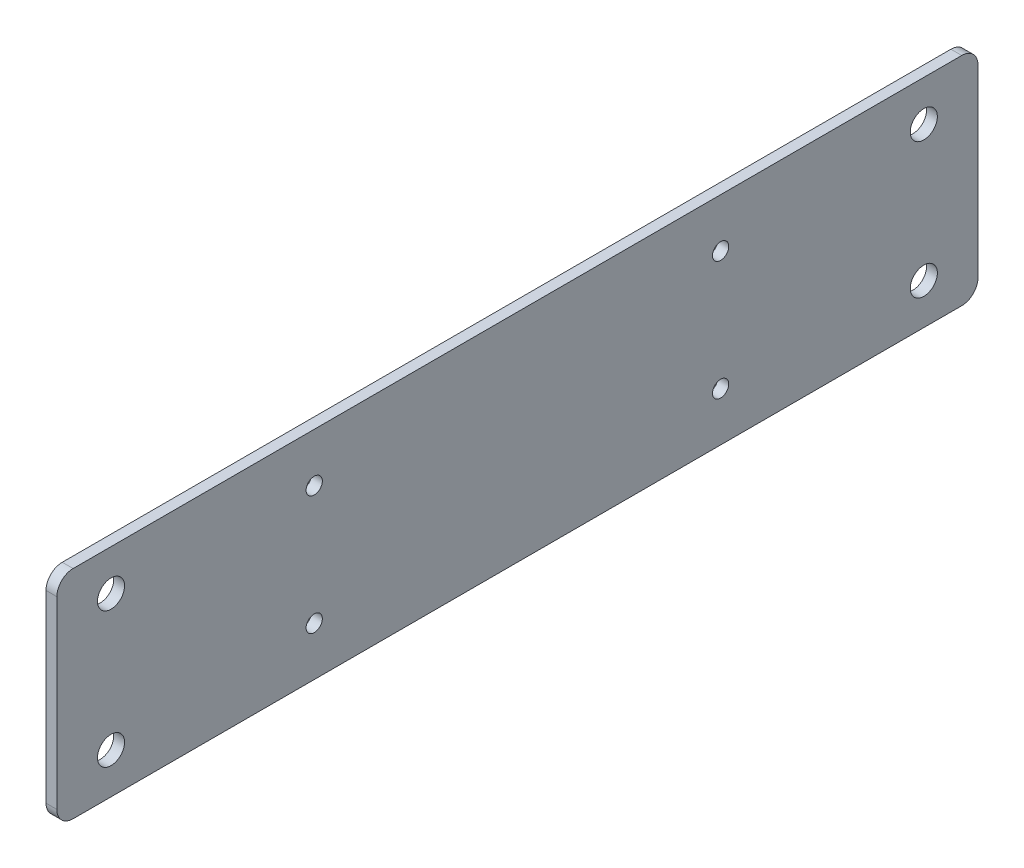
ISO-10303-21;
HEADER;
FILE_DESCRIPTION(('STEP AP214'),'2;1');
FILE_NAME('part.step','',(''),(''),'','','');
FILE_SCHEMA(('AUTOMOTIVE_DESIGN { 1 0 10303 214 1 1 1 1 }'));
ENDSEC;
DATA;
#1=APPLICATION_CONTEXT('core data for automotive mechanical design processes');
#2=APPLICATION_PROTOCOL_DEFINITION('international standard','automotive_design',2000,#1);
#3=PRODUCT_CONTEXT('',#1,'mechanical');
#4=PRODUCT('Part','Part','',(#3));
#5=PRODUCT_RELATED_PRODUCT_CATEGORY('part','',(#4));
#6=PRODUCT_DEFINITION_FORMATION('','',#4);
#7=PRODUCT_DEFINITION_CONTEXT('part definition',#1,'design');
#8=PRODUCT_DEFINITION('design','',#6,#7);
#9=PRODUCT_DEFINITION_SHAPE('','',#8);
#10=(LENGTH_UNIT() NAMED_UNIT(*) SI_UNIT(.MILLI.,.METRE.));
#11=(NAMED_UNIT(*) PLANE_ANGLE_UNIT() SI_UNIT($,.RADIAN.));
#12=(NAMED_UNIT(*) SI_UNIT($,.STERADIAN.) SOLID_ANGLE_UNIT());
#13=UNCERTAINTY_MEASURE_WITH_UNIT(LENGTH_MEASURE(1.E-05),#10,'distance_accuracy_value','');
#14=(GEOMETRIC_REPRESENTATION_CONTEXT(3) GLOBAL_UNCERTAINTY_ASSIGNED_CONTEXT((#13)) GLOBAL_UNIT_ASSIGNED_CONTEXT((#10,
#11,#12)) REPRESENTATION_CONTEXT('',''));
#15=CARTESIAN_POINT('',(0.,0.,0.));
#16=DIRECTION('',(0.,0.,1.));
#17=DIRECTION('',(1.,0.,0.));
#18=AXIS2_PLACEMENT_3D('',#15,#16,#17);
#19=CARTESIAN_POINT('',(2.,20.,-85.));
#20=DIRECTION('',(0.,0.,1.));
#21=DIRECTION('',(1.,0.,0.));
#22=AXIS2_PLACEMENT_3D('',#19,#20,#21);
#23=PLANE('',#22);
#24=DIRECTION('',(0.,1.,0.));
#25=VECTOR('',#24,1.);
#26=CARTESIAN_POINT('',(2.,20.,-85.));
#27=LINE('',#26,#25);
#28=CARTESIAN_POINT('',(2.,-17.,-85.));
#29=VERTEX_POINT('',#28);
#30=CARTESIAN_POINT('',(2.,17.,-85.));
#31=VERTEX_POINT('',#30);
#32=EDGE_CURVE('E121',#29,#31,#27,.T.);
#33=ORIENTED_EDGE('',*,*,#32,.F.);
#34=DIRECTION('',(-1.,0.,0.));
#35=VECTOR('',#34,1.);
#36=CARTESIAN_POINT('',(2.,-17.,-85.));
#37=LINE('',#36,#35);
#38=CARTESIAN_POINT('',(0.,-17.,-85.));
#39=VERTEX_POINT('',#38);
#40=EDGE_CURVE('E106',#29,#39,#37,.T.);
#41=ORIENTED_EDGE('',*,*,#40,.T.);
#42=DIRECTION('',(0.,1.,0.));
#43=VECTOR('',#42,1.);
#44=CARTESIAN_POINT('',(0.,20.,-85.));
#45=LINE('',#44,#43);
#46=CARTESIAN_POINT('',(0.,17.,-85.));
#47=VERTEX_POINT('',#46);
#48=EDGE_CURVE('E118',#39,#47,#45,.T.);
#49=ORIENTED_EDGE('',*,*,#48,.T.);
#50=DIRECTION('',(-1.,0.,0.));
#51=VECTOR('',#50,1.);
#52=CARTESIAN_POINT('',(2.,17.,-85.));
#53=LINE('',#52,#51);
#54=EDGE_CURVE('E123',#47,#31,#53,.F.);
#55=ORIENTED_EDGE('',*,*,#54,.T.);
#56=EDGE_LOOP('',(#33,#41,#49,#55));
#57=FACE_BOUND('',#56,.T.);
#58=ADVANCED_FACE('F35',(#57),#23,.F.);
#59=CARTESIAN_POINT('',(2.,20.,85.));
#60=DIRECTION('',(0.,-1.,0.));
#61=DIRECTION('',(0.,0.,-1.));
#62=AXIS2_PLACEMENT_3D('',#59,#60,#61);
#63=PLANE('',#62);
#64=DIRECTION('',(0.,0.,1.));
#65=VECTOR('',#64,1.);
#66=CARTESIAN_POINT('',(2.,20.,85.));
#67=LINE('',#66,#65);
#68=CARTESIAN_POINT('',(2.,20.,-82.));
#69=VERTEX_POINT('',#68);
#70=CARTESIAN_POINT('',(2.,20.,82.));
#71=VERTEX_POINT('',#70);
#72=EDGE_CURVE('E165',#69,#71,#67,.T.);
#73=ORIENTED_EDGE('',*,*,#72,.F.);
#74=DIRECTION('',(-1.,0.,0.));
#75=VECTOR('',#74,1.);
#76=CARTESIAN_POINT('',(2.,20.,-82.));
#77=LINE('',#76,#75);
#78=CARTESIAN_POINT('',(0.,20.,-82.));
#79=VERTEX_POINT('',#78);
#80=EDGE_CURVE('E11',#69,#79,#77,.T.);
#81=ORIENTED_EDGE('',*,*,#80,.T.);
#82=DIRECTION('',(0.,0.,1.));
#83=VECTOR('',#82,1.);
#84=CARTESIAN_POINT('',(0.,20.,85.));
#85=LINE('',#84,#83);
#86=CARTESIAN_POINT('',(0.,20.,82.));
#87=VERTEX_POINT('',#86);
#88=EDGE_CURVE('E128',#79,#87,#85,.T.);
#89=ORIENTED_EDGE('',*,*,#88,.T.);
#90=DIRECTION('',(-1.,0.,0.));
#91=VECTOR('',#90,1.);
#92=CARTESIAN_POINT('',(2.,20.,82.));
#93=LINE('',#92,#91);
#94=EDGE_CURVE('E43',#87,#71,#93,.F.);
#95=ORIENTED_EDGE('',*,*,#94,.T.);
#96=EDGE_LOOP('',(#73,#81,#89,#95));
#97=FACE_BOUND('',#96,.T.);
#98=ADVANCED_FACE('F164',(#97),#63,.F.);
#99=CARTESIAN_POINT('',(2.,20.,85.));
#100=DIRECTION('',(0.,0.,-1.));
#101=DIRECTION('',(-1.,0.,0.));
#102=AXIS2_PLACEMENT_3D('',#99,#100,#101);
#103=PLANE('',#102);
#104=DIRECTION('',(0.,-1.,0.));
#105=VECTOR('',#104,1.);
#106=CARTESIAN_POINT('',(0.,20.,85.));
#107=LINE('',#106,#105);
#108=CARTESIAN_POINT('',(0.,17.,85.));
#109=VERTEX_POINT('',#108);
#110=CARTESIAN_POINT('',(0.,-17.,85.));
#111=VERTEX_POINT('',#110);
#112=EDGE_CURVE('E132',#109,#111,#107,.T.);
#113=ORIENTED_EDGE('',*,*,#112,.T.);
#114=DIRECTION('',(-1.,0.,0.));
#115=VECTOR('',#114,1.);
#116=CARTESIAN_POINT('',(2.,-17.,85.));
#117=LINE('',#116,#115);
#118=CARTESIAN_POINT('',(2.,-17.,85.));
#119=VERTEX_POINT('',#118);
#120=EDGE_CURVE('E50',#111,#119,#117,.F.);
#121=ORIENTED_EDGE('',*,*,#120,.T.);
#122=DIRECTION('',(0.,-1.,0.));
#123=VECTOR('',#122,1.);
#124=CARTESIAN_POINT('',(2.,20.,85.));
#125=LINE('',#124,#123);
#126=CARTESIAN_POINT('',(2.,17.,85.));
#127=VERTEX_POINT('',#126);
#128=EDGE_CURVE('E171',#127,#119,#125,.T.);
#129=ORIENTED_EDGE('',*,*,#128,.F.);
#130=DIRECTION('',(-1.,0.,0.));
#131=VECTOR('',#130,1.);
#132=CARTESIAN_POINT('',(2.,17.,85.));
#133=LINE('',#132,#131);
#134=EDGE_CURVE('E158',#127,#109,#133,.T.);
#135=ORIENTED_EDGE('',*,*,#134,.T.);
#136=EDGE_LOOP('',(#113,#121,#129,#135));
#137=FACE_BOUND('',#136,.T.);
#138=ADVANCED_FACE('F175',(#137),#103,.F.);
#139=CARTESIAN_POINT('',(2.,-20.,85.));
#140=DIRECTION('',(0.,1.,0.));
#141=DIRECTION('',(0.,0.,1.));
#142=AXIS2_PLACEMENT_3D('',#139,#140,#141);
#143=PLANE('',#142);
#144=DIRECTION('',(0.,0.,-1.));
#145=VECTOR('',#144,1.);
#146=CARTESIAN_POINT('',(0.,-20.,85.));
#147=LINE('',#146,#145);
#148=CARTESIAN_POINT('',(0.,-20.,82.));
#149=VERTEX_POINT('',#148);
#150=CARTESIAN_POINT('',(0.,-20.,-82.));
#151=VERTEX_POINT('',#150);
#152=EDGE_CURVE('E142',#149,#151,#147,.T.);
#153=ORIENTED_EDGE('',*,*,#152,.T.);
#154=DIRECTION('',(-1.,0.,0.));
#155=VECTOR('',#154,1.);
#156=CARTESIAN_POINT('',(2.,-20.,-82.));
#157=LINE('',#156,#155);
#158=CARTESIAN_POINT('',(2.,-20.,-82.));
#159=VERTEX_POINT('',#158);
#160=EDGE_CURVE('E107',#151,#159,#157,.F.);
#161=ORIENTED_EDGE('',*,*,#160,.T.);
#162=DIRECTION('',(0.,0.,-1.));
#163=VECTOR('',#162,1.);
#164=CARTESIAN_POINT('',(2.,-20.,85.));
#165=LINE('',#164,#163);
#166=CARTESIAN_POINT('',(2.,-20.,82.));
#167=VERTEX_POINT('',#166);
#168=EDGE_CURVE('E138',#167,#159,#165,.T.);
#169=ORIENTED_EDGE('',*,*,#168,.F.);
#170=DIRECTION('',(-1.,0.,0.));
#171=VECTOR('',#170,1.);
#172=CARTESIAN_POINT('',(2.,-20.,82.));
#173=LINE('',#172,#171);
#174=EDGE_CURVE('E112',#167,#149,#173,.T.);
#175=ORIENTED_EDGE('',*,*,#174,.T.);
#176=EDGE_LOOP('',(#153,#161,#169,#175));
#177=FACE_BOUND('',#176,.T.);
#178=ADVANCED_FACE('F182',(#177),#143,.F.);
#179=CARTESIAN_POINT('',(2.,0.,0.));
#180=DIRECTION('',(1.,0.,0.));
#181=DIRECTION('',(0.,0.,-1.));
#182=AXIS2_PLACEMENT_3D('',#179,#180,#181);
#183=PLANE('',#182);
#184=CARTESIAN_POINT('',(2.,-11.,37.5));
#185=DIRECTION('',(1.,0.,0.));
#186=DIRECTION('',(0.,0.,-1.));
#187=AXIS2_PLACEMENT_3D('',#184,#185,#186);
#188=CIRCLE('',#187,1.5);
#189=CARTESIAN_POINT('',(2.,-11.,36.));
#190=VERTEX_POINT('',#189);
#191=EDGE_CURVE('E219',#190,#190,#188,.T.);
#192=ORIENTED_EDGE('',*,*,#191,.F.);
#193=EDGE_LOOP('',(#192));
#194=FACE_BOUND('',#193,.T.);
#195=CARTESIAN_POINT('',(2.,11.,-37.5));
#196=DIRECTION('',(1.,0.,0.));
#197=DIRECTION('',(0.,0.,-1.));
#198=AXIS2_PLACEMENT_3D('',#195,#196,#197);
#199=CIRCLE('',#198,1.5);
#200=CARTESIAN_POINT('',(2.,11.,-39.));
#201=VERTEX_POINT('',#200);
#202=EDGE_CURVE('E212',#201,#201,#199,.T.);
#203=ORIENTED_EDGE('',*,*,#202,.F.);
#204=EDGE_LOOP('',(#203));
#205=FACE_BOUND('',#204,.T.);
#206=CARTESIAN_POINT('',(2.,-11.,-37.5));
#207=DIRECTION('',(1.,0.,0.));
#208=DIRECTION('',(0.,0.,-1.));
#209=AXIS2_PLACEMENT_3D('',#206,#207,#208);
#210=CIRCLE('',#209,1.5);
#211=CARTESIAN_POINT('',(2.,-11.,-39.));
#212=VERTEX_POINT('',#211);
#213=EDGE_CURVE('E224',#212,#212,#210,.T.);
#214=ORIENTED_EDGE('',*,*,#213,.F.);
#215=EDGE_LOOP('',(#214));
#216=FACE_BOUND('',#215,.T.);
#217=CARTESIAN_POINT('',(2.,11.,37.5));
#218=DIRECTION('',(1.,0.,0.));
#219=DIRECTION('',(0.,0.,-1.));
#220=AXIS2_PLACEMENT_3D('',#217,#218,#219);
#221=CIRCLE('',#220,1.5);
#222=CARTESIAN_POINT('',(2.,11.,36.));
#223=VERTEX_POINT('',#222);
#224=EDGE_CURVE('E206',#223,#223,#221,.T.);
#225=ORIENTED_EDGE('',*,*,#224,.F.);
#226=EDGE_LOOP('',(#225));
#227=FACE_BOUND('',#226,.T.);
#228=CARTESIAN_POINT('',(2.,12.5,-75.));
#229=DIRECTION('',(1.,0.,0.));
#230=DIRECTION('',(0.,0.,1.));
#231=AXIS2_PLACEMENT_3D('',#228,#229,#230);
#232=CIRCLE('',#231,2.49999999999999);
#233=CARTESIAN_POINT('',(2.,12.5,-72.5));
#234=VERTEX_POINT('',#233);
#235=EDGE_CURVE('E188',#234,#234,#232,.T.);
#236=ORIENTED_EDGE('',*,*,#235,.F.);
#237=EDGE_LOOP('',(#236));
#238=FACE_BOUND('',#237,.T.);
#239=CARTESIAN_POINT('',(2.,-12.5,-75.));
#240=DIRECTION('',(1.,0.,0.));
#241=DIRECTION('',(0.,0.,-1.));
#242=AXIS2_PLACEMENT_3D('',#239,#240,#241);
#243=CIRCLE('',#242,2.49999999999999);
#244=CARTESIAN_POINT('',(2.,-12.5,-77.5));
#245=VERTEX_POINT('',#244);
#246=EDGE_CURVE('E195',#245,#245,#243,.T.);
#247=ORIENTED_EDGE('',*,*,#246,.F.);
#248=EDGE_LOOP('',(#247));
#249=FACE_BOUND('',#248,.T.);
#250=CARTESIAN_POINT('',(2.,-12.5,75.));
#251=DIRECTION('',(1.,0.,0.));
#252=DIRECTION('',(0.,0.,1.));
#253=AXIS2_PLACEMENT_3D('',#250,#251,#252);
#254=CIRCLE('',#253,2.49999999999999);
#255=CARTESIAN_POINT('',(2.,-12.5,77.5));
#256=VERTEX_POINT('',#255);
#257=EDGE_CURVE('E201',#256,#256,#254,.T.);
#258=ORIENTED_EDGE('',*,*,#257,.F.);
#259=EDGE_LOOP('',(#258));
#260=FACE_BOUND('',#259,.T.);
#261=CARTESIAN_POINT('',(2.,12.5,75.));
#262=DIRECTION('',(1.,0.,0.));
#263=DIRECTION('',(0.,0.,-1.));
#264=AXIS2_PLACEMENT_3D('',#261,#262,#263);
#265=CIRCLE('',#264,2.49999999999999);
#266=CARTESIAN_POINT('',(2.,12.5,72.5));
#267=VERTEX_POINT('',#266);
#268=EDGE_CURVE('E135',#267,#267,#265,.T.);
#269=ORIENTED_EDGE('',*,*,#268,.F.);
#270=EDGE_LOOP('',(#269));
#271=FACE_BOUND('',#270,.T.);
#272=ORIENTED_EDGE('',*,*,#168,.T.);
#273=CARTESIAN_POINT('',(2.,-17.,-82.));
#274=DIRECTION('',(1.,0.,0.));
#275=DIRECTION('',(0.,0.,-1.));
#276=AXIS2_PLACEMENT_3D('',#273,#274,#275);
#277=CIRCLE('',#276,3.);
#278=EDGE_CURVE('E156',#159,#29,#277,.T.);
#279=ORIENTED_EDGE('',*,*,#278,.T.);
#280=ORIENTED_EDGE('',*,*,#32,.T.);
#281=CARTESIAN_POINT('',(2.,17.,-82.));
#282=DIRECTION('',(1.,0.,0.));
#283=DIRECTION('',(0.,0.,-1.));
#284=AXIS2_PLACEMENT_3D('',#281,#282,#283);
#285=CIRCLE('',#284,3.);
#286=EDGE_CURVE('E152',#31,#69,#285,.T.);
#287=ORIENTED_EDGE('',*,*,#286,.T.);
#288=ORIENTED_EDGE('',*,*,#72,.T.);
#289=CARTESIAN_POINT('',(2.,17.,82.));
#290=DIRECTION('',(1.,0.,0.));
#291=DIRECTION('',(0.,0.,-1.));
#292=AXIS2_PLACEMENT_3D('',#289,#290,#291);
#293=CIRCLE('',#292,3.);
#294=EDGE_CURVE('E57',#71,#127,#293,.T.);
#295=ORIENTED_EDGE('',*,*,#294,.T.);
#296=ORIENTED_EDGE('',*,*,#128,.T.);
#297=CARTESIAN_POINT('',(2.,-17.,82.));
#298=DIRECTION('',(1.,0.,0.));
#299=DIRECTION('',(0.,0.,-1.));
#300=AXIS2_PLACEMENT_3D('',#297,#298,#299);
#301=CIRCLE('',#300,3.);
#302=EDGE_CURVE('E154',#119,#167,#301,.T.);
#303=ORIENTED_EDGE('',*,*,#302,.T.);
#304=EDGE_LOOP('',(#272,#279,#280,#287,#288,#295,#296,#303));
#305=FACE_BOUND('',#304,.T.);
#306=ADVANCED_FACE('F169',(#194,#205,#216,#227,#238,#249,#260,#271,#305),#183,.T.);
#307=CARTESIAN_POINT('',(0.,0.,0.));
#308=DIRECTION('',(1.,0.,0.));
#309=DIRECTION('',(0.,0.,-1.));
#310=AXIS2_PLACEMENT_3D('',#307,#308,#309);
#311=PLANE('',#310);
#312=CARTESIAN_POINT('',(0.,-11.,37.5));
#313=DIRECTION('',(1.,0.,0.));
#314=DIRECTION('',(0.,0.,-1.));
#315=AXIS2_PLACEMENT_3D('',#312,#313,#314);
#316=CIRCLE('',#315,1.5);
#317=CARTESIAN_POINT('',(0.,-11.,36.));
#318=VERTEX_POINT('',#317);
#319=EDGE_CURVE('E209',#318,#318,#316,.T.);
#320=ORIENTED_EDGE('',*,*,#319,.T.);
#321=EDGE_LOOP('',(#320));
#322=FACE_BOUND('',#321,.T.);
#323=CARTESIAN_POINT('',(0.,11.,-37.5));
#324=DIRECTION('',(1.,0.,0.));
#325=DIRECTION('',(0.,0.,-1.));
#326=AXIS2_PLACEMENT_3D('',#323,#324,#325);
#327=CIRCLE('',#326,1.5);
#328=CARTESIAN_POINT('',(0.,11.,-39.));
#329=VERTEX_POINT('',#328);
#330=EDGE_CURVE('E215',#329,#329,#327,.T.);
#331=ORIENTED_EDGE('',*,*,#330,.T.);
#332=EDGE_LOOP('',(#331));
#333=FACE_BOUND('',#332,.T.);
#334=CARTESIAN_POINT('',(0.,-11.,-37.5));
#335=DIRECTION('',(1.,0.,0.));
#336=DIRECTION('',(0.,0.,-1.));
#337=AXIS2_PLACEMENT_3D('',#334,#335,#336);
#338=CIRCLE('',#337,1.5);
#339=CARTESIAN_POINT('',(0.,-11.,-39.));
#340=VERTEX_POINT('',#339);
#341=EDGE_CURVE('E216',#340,#340,#338,.T.);
#342=ORIENTED_EDGE('',*,*,#341,.T.);
#343=EDGE_LOOP('',(#342));
#344=FACE_BOUND('',#343,.T.);
#345=CARTESIAN_POINT('',(0.,11.,37.5));
#346=DIRECTION('',(1.,0.,0.));
#347=DIRECTION('',(0.,0.,-1.));
#348=AXIS2_PLACEMENT_3D('',#345,#346,#347);
#349=CIRCLE('',#348,1.5);
#350=CARTESIAN_POINT('',(0.,11.,36.));
#351=VERTEX_POINT('',#350);
#352=EDGE_CURVE('E192',#351,#351,#349,.T.);
#353=ORIENTED_EDGE('',*,*,#352,.T.);
#354=EDGE_LOOP('',(#353));
#355=FACE_BOUND('',#354,.T.);
#356=CARTESIAN_POINT('',(0.,12.5,-75.));
#357=DIRECTION('',(1.,0.,0.));
#358=DIRECTION('',(0.,0.,1.));
#359=AXIS2_PLACEMENT_3D('',#356,#357,#358);
#360=CIRCLE('',#359,2.49999999999999);
#361=CARTESIAN_POINT('',(0.,12.5,-72.5));
#362=VERTEX_POINT('',#361);
#363=EDGE_CURVE('E191',#362,#362,#360,.T.);
#364=ORIENTED_EDGE('',*,*,#363,.T.);
#365=EDGE_LOOP('',(#364));
#366=FACE_BOUND('',#365,.T.);
#367=CARTESIAN_POINT('',(0.,-12.5,-75.));
#368=DIRECTION('',(1.,0.,0.));
#369=DIRECTION('',(0.,0.,-1.));
#370=AXIS2_PLACEMENT_3D('',#367,#368,#369);
#371=CIRCLE('',#370,2.49999999999999);
#372=CARTESIAN_POINT('',(0.,-12.5,-77.5));
#373=VERTEX_POINT('',#372);
#374=EDGE_CURVE('E198',#373,#373,#371,.T.);
#375=ORIENTED_EDGE('',*,*,#374,.T.);
#376=EDGE_LOOP('',(#375));
#377=FACE_BOUND('',#376,.T.);
#378=CARTESIAN_POINT('',(0.,-12.5,75.));
#379=DIRECTION('',(1.,0.,0.));
#380=DIRECTION('',(0.,0.,1.));
#381=AXIS2_PLACEMENT_3D('',#378,#379,#380);
#382=CIRCLE('',#381,2.49999999999999);
#383=CARTESIAN_POINT('',(0.,-12.5,77.5));
#384=VERTEX_POINT('',#383);
#385=EDGE_CURVE('E186',#384,#384,#382,.T.);
#386=ORIENTED_EDGE('',*,*,#385,.T.);
#387=EDGE_LOOP('',(#386));
#388=FACE_BOUND('',#387,.T.);
#389=CARTESIAN_POINT('',(0.,12.5,75.));
#390=DIRECTION('',(1.,0.,0.));
#391=DIRECTION('',(0.,0.,-1.));
#392=AXIS2_PLACEMENT_3D('',#389,#390,#391);
#393=CIRCLE('',#392,2.49999999999999);
#394=CARTESIAN_POINT('',(0.,12.5,72.5));
#395=VERTEX_POINT('',#394);
#396=EDGE_CURVE('E129',#395,#395,#393,.T.);
#397=ORIENTED_EDGE('',*,*,#396,.T.);
#398=EDGE_LOOP('',(#397));
#399=FACE_BOUND('',#398,.T.);
#400=ORIENTED_EDGE('',*,*,#48,.F.);
#401=CARTESIAN_POINT('',(0.,-17.,-82.));
#402=DIRECTION('',(1.,0.,0.));
#403=DIRECTION('',(0.,0.,-1.));
#404=AXIS2_PLACEMENT_3D('',#401,#402,#403);
#405=CIRCLE('',#404,3.);
#406=EDGE_CURVE('E102',#39,#151,#405,.F.);
#407=ORIENTED_EDGE('',*,*,#406,.T.);
#408=ORIENTED_EDGE('',*,*,#152,.F.);
#409=CARTESIAN_POINT('',(0.,-17.,82.));
#410=DIRECTION('',(1.,0.,0.));
#411=DIRECTION('',(0.,0.,-1.));
#412=AXIS2_PLACEMENT_3D('',#409,#410,#411);
#413=CIRCLE('',#412,3.);
#414=EDGE_CURVE('E113',#149,#111,#413,.F.);
#415=ORIENTED_EDGE('',*,*,#414,.T.);
#416=ORIENTED_EDGE('',*,*,#112,.F.);
#417=CARTESIAN_POINT('',(0.,17.,82.));
#418=DIRECTION('',(1.,0.,0.));
#419=DIRECTION('',(0.,0.,-1.));
#420=AXIS2_PLACEMENT_3D('',#417,#418,#419);
#421=CIRCLE('',#420,3.);
#422=EDGE_CURVE('E122',#109,#87,#421,.F.);
#423=ORIENTED_EDGE('',*,*,#422,.T.);
#424=ORIENTED_EDGE('',*,*,#88,.F.);
#425=CARTESIAN_POINT('',(0.,17.,-82.));
#426=DIRECTION('',(1.,0.,0.));
#427=DIRECTION('',(0.,0.,-1.));
#428=AXIS2_PLACEMENT_3D('',#425,#426,#427);
#429=CIRCLE('',#428,3.);
#430=EDGE_CURVE('E127',#79,#47,#429,.F.);
#431=ORIENTED_EDGE('',*,*,#430,.T.);
#432=EDGE_LOOP('',(#400,#407,#408,#415,#416,#423,#424,#431));
#433=FACE_BOUND('',#432,.T.);
#434=ADVANCED_FACE('F125',(#322,#333,#344,#355,#366,#377,#388,#399,#433),#311,.F.);
#435=CARTESIAN_POINT('',(0.,12.5,75.));
#436=DIRECTION('',(1.,0.,0.));
#437=DIRECTION('',(0.,0.,-1.));
#438=AXIS2_PLACEMENT_3D('',#435,#436,#437);
#439=CYLINDRICAL_SURFACE('',#438,2.49999999999999);
#440=ORIENTED_EDGE('',*,*,#396,.F.);
#441=EDGE_LOOP('',(#440));
#442=FACE_BOUND('',#441,.T.);
#443=ORIENTED_EDGE('',*,*,#268,.T.);
#444=EDGE_LOOP('',(#443));
#445=FACE_BOUND('',#444,.T.);
#446=ADVANCED_FACE('F254',(#442,#445),#439,.F.);
#447=CARTESIAN_POINT('',(0.,-12.5,75.));
#448=DIRECTION('',(1.,0.,0.));
#449=DIRECTION('',(0.,0.,-1.));
#450=AXIS2_PLACEMENT_3D('',#447,#448,#449);
#451=CYLINDRICAL_SURFACE('',#450,2.49999999999999);
#452=ORIENTED_EDGE('',*,*,#385,.F.);
#453=EDGE_LOOP('',(#452));
#454=FACE_BOUND('',#453,.T.);
#455=ORIENTED_EDGE('',*,*,#257,.T.);
#456=EDGE_LOOP('',(#455));
#457=FACE_BOUND('',#456,.T.);
#458=ADVANCED_FACE('F256',(#454,#457),#451,.F.);
#459=CARTESIAN_POINT('',(0.,-12.5,-75.));
#460=DIRECTION('',(1.,0.,0.));
#461=DIRECTION('',(0.,0.,-1.));
#462=AXIS2_PLACEMENT_3D('',#459,#460,#461);
#463=CYLINDRICAL_SURFACE('',#462,2.49999999999999);
#464=ORIENTED_EDGE('',*,*,#374,.F.);
#465=EDGE_LOOP('',(#464));
#466=FACE_BOUND('',#465,.T.);
#467=ORIENTED_EDGE('',*,*,#246,.T.);
#468=EDGE_LOOP('',(#467));
#469=FACE_BOUND('',#468,.T.);
#470=ADVANCED_FACE('F263',(#466,#469),#463,.F.);
#471=CARTESIAN_POINT('',(0.,12.5,-75.));
#472=DIRECTION('',(1.,0.,0.));
#473=DIRECTION('',(0.,0.,-1.));
#474=AXIS2_PLACEMENT_3D('',#471,#472,#473);
#475=CYLINDRICAL_SURFACE('',#474,2.49999999999999);
#476=ORIENTED_EDGE('',*,*,#363,.F.);
#477=EDGE_LOOP('',(#476));
#478=FACE_BOUND('',#477,.T.);
#479=ORIENTED_EDGE('',*,*,#235,.T.);
#480=EDGE_LOOP('',(#479));
#481=FACE_BOUND('',#480,.T.);
#482=ADVANCED_FACE('F377',(#478,#481),#475,.F.);
#483=CARTESIAN_POINT('',(0.,11.,37.5));
#484=DIRECTION('',(1.,0.,0.));
#485=DIRECTION('',(0.,0.,-1.));
#486=AXIS2_PLACEMENT_3D('',#483,#484,#485);
#487=CYLINDRICAL_SURFACE('',#486,1.5);
#488=ORIENTED_EDGE('',*,*,#352,.F.);
#489=EDGE_LOOP('',(#488));
#490=FACE_BOUND('',#489,.T.);
#491=ORIENTED_EDGE('',*,*,#224,.T.);
#492=EDGE_LOOP('',(#491));
#493=FACE_BOUND('',#492,.T.);
#494=ADVANCED_FACE('F236',(#490,#493),#487,.F.);
#495=CARTESIAN_POINT('',(0.,-11.,-37.5));
#496=DIRECTION('',(1.,0.,0.));
#497=DIRECTION('',(0.,0.,-1.));
#498=AXIS2_PLACEMENT_3D('',#495,#496,#497);
#499=CYLINDRICAL_SURFACE('',#498,1.5);
#500=ORIENTED_EDGE('',*,*,#341,.F.);
#501=EDGE_LOOP('',(#500));
#502=FACE_BOUND('',#501,.T.);
#503=ORIENTED_EDGE('',*,*,#213,.T.);
#504=EDGE_LOOP('',(#503));
#505=FACE_BOUND('',#504,.T.);
#506=ADVANCED_FACE('F232',(#502,#505),#499,.F.);
#507=CARTESIAN_POINT('',(0.,11.,-37.5));
#508=DIRECTION('',(1.,0.,0.));
#509=DIRECTION('',(0.,0.,-1.));
#510=AXIS2_PLACEMENT_3D('',#507,#508,#509);
#511=CYLINDRICAL_SURFACE('',#510,1.5);
#512=ORIENTED_EDGE('',*,*,#330,.F.);
#513=EDGE_LOOP('',(#512));
#514=FACE_BOUND('',#513,.T.);
#515=ORIENTED_EDGE('',*,*,#202,.T.);
#516=EDGE_LOOP('',(#515));
#517=FACE_BOUND('',#516,.T.);
#518=ADVANCED_FACE('F235',(#514,#517),#511,.F.);
#519=CARTESIAN_POINT('',(0.,-11.,37.5));
#520=DIRECTION('',(1.,0.,0.));
#521=DIRECTION('',(0.,0.,-1.));
#522=AXIS2_PLACEMENT_3D('',#519,#520,#521);
#523=CYLINDRICAL_SURFACE('',#522,1.5);
#524=ORIENTED_EDGE('',*,*,#319,.F.);
#525=EDGE_LOOP('',(#524));
#526=FACE_BOUND('',#525,.T.);
#527=ORIENTED_EDGE('',*,*,#191,.T.);
#528=EDGE_LOOP('',(#527));
#529=FACE_BOUND('',#528,.T.);
#530=ADVANCED_FACE('F280',(#526,#529),#523,.F.);
#531=CARTESIAN_POINT('',(2.,-17.,-82.));
#532=DIRECTION('',(-1.,0.,0.));
#533=DIRECTION('',(0.,0.,1.));
#534=AXIS2_PLACEMENT_3D('',#531,#532,#533);
#535=CYLINDRICAL_SURFACE('',#534,3.);
#536=ORIENTED_EDGE('',*,*,#278,.F.);
#537=ORIENTED_EDGE('',*,*,#160,.F.);
#538=ORIENTED_EDGE('',*,*,#406,.F.);
#539=ORIENTED_EDGE('',*,*,#40,.F.);
#540=EDGE_LOOP('',(#536,#537,#538,#539));
#541=FACE_BOUND('',#540,.T.);
#542=ADVANCED_FACE('F105',(#541),#535,.T.);
#543=CARTESIAN_POINT('',(2.,-17.,82.));
#544=DIRECTION('',(-1.,0.,0.));
#545=DIRECTION('',(0.,0.,1.));
#546=AXIS2_PLACEMENT_3D('',#543,#544,#545);
#547=CYLINDRICAL_SURFACE('',#546,3.);
#548=ORIENTED_EDGE('',*,*,#302,.F.);
#549=ORIENTED_EDGE('',*,*,#120,.F.);
#550=ORIENTED_EDGE('',*,*,#414,.F.);
#551=ORIENTED_EDGE('',*,*,#174,.F.);
#552=EDGE_LOOP('',(#548,#549,#550,#551));
#553=FACE_BOUND('',#552,.T.);
#554=ADVANCED_FACE('F179',(#553),#547,.T.);
#555=CARTESIAN_POINT('',(2.,17.,-82.));
#556=DIRECTION('',(-1.,0.,0.));
#557=DIRECTION('',(0.,0.,1.));
#558=AXIS2_PLACEMENT_3D('',#555,#556,#557);
#559=CYLINDRICAL_SURFACE('',#558,3.);
#560=ORIENTED_EDGE('',*,*,#286,.F.);
#561=ORIENTED_EDGE('',*,*,#54,.F.);
#562=ORIENTED_EDGE('',*,*,#430,.F.);
#563=ORIENTED_EDGE('',*,*,#80,.F.);
#564=EDGE_LOOP('',(#560,#561,#562,#563));
#565=FACE_BOUND('',#564,.T.);
#566=ADVANCED_FACE('F282',(#565),#559,.T.);
#567=CARTESIAN_POINT('',(2.,17.,82.));
#568=DIRECTION('',(-1.,0.,0.));
#569=DIRECTION('',(0.,0.,1.));
#570=AXIS2_PLACEMENT_3D('',#567,#568,#569);
#571=CYLINDRICAL_SURFACE('',#570,3.);
#572=ORIENTED_EDGE('',*,*,#294,.F.);
#573=ORIENTED_EDGE('',*,*,#94,.F.);
#574=ORIENTED_EDGE('',*,*,#422,.F.);
#575=ORIENTED_EDGE('',*,*,#134,.F.);
#576=EDGE_LOOP('',(#572,#573,#574,#575));
#577=FACE_BOUND('',#576,.T.);
#578=ADVANCED_FACE('F37',(#577),#571,.T.);
#579=CLOSED_SHELL('',(#58,#98,#138,#178,#306,#434,#446,#458,#470,#482,#494,#506,#518,#530,#542,
#554,#566,#578));
#580=MANIFOLD_SOLID_BREP('B2',#579);
#581=ADVANCED_BREP_SHAPE_REPRESENTATION('',(#18,#580),#14);
#582=SHAPE_DEFINITION_REPRESENTATION(#9,#581);
ENDSEC;
END-ISO-10303-21;
